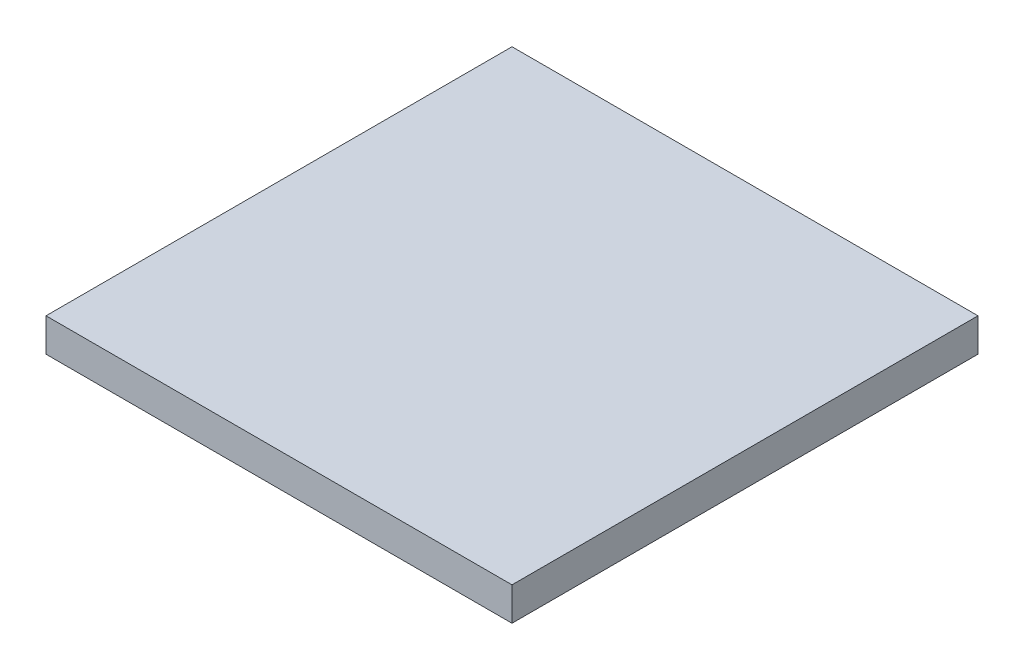
ISO-10303-21;
HEADER;
FILE_DESCRIPTION(('STEP AP214'),'2;1');
FILE_NAME('part.step','',(''),(''),'','','');
FILE_SCHEMA(('AUTOMOTIVE_DESIGN { 1 0 10303 214 1 1 1 1 }'));
ENDSEC;
DATA;
#1=APPLICATION_CONTEXT('core data for automotive mechanical design processes');
#2=APPLICATION_PROTOCOL_DEFINITION('international standard','automotive_design',2000,#1);
#3=PRODUCT_CONTEXT('',#1,'mechanical');
#4=PRODUCT('Part','Part','',(#3));
#5=PRODUCT_RELATED_PRODUCT_CATEGORY('part','',(#4));
#6=PRODUCT_DEFINITION_FORMATION('','',#4);
#7=PRODUCT_DEFINITION_CONTEXT('part definition',#1,'design');
#8=PRODUCT_DEFINITION('design','',#6,#7);
#9=PRODUCT_DEFINITION_SHAPE('','',#8);
#10=(LENGTH_UNIT() NAMED_UNIT(*) SI_UNIT(.MILLI.,.METRE.));
#11=(NAMED_UNIT(*) PLANE_ANGLE_UNIT() SI_UNIT($,.RADIAN.));
#12=(NAMED_UNIT(*) SI_UNIT($,.STERADIAN.) SOLID_ANGLE_UNIT());
#13=UNCERTAINTY_MEASURE_WITH_UNIT(LENGTH_MEASURE(1.E-05),#10,'distance_accuracy_value','');
#14=(GEOMETRIC_REPRESENTATION_CONTEXT(3) GLOBAL_UNCERTAINTY_ASSIGNED_CONTEXT((#13)) GLOBAL_UNIT_ASSIGNED_CONTEXT((#10,
#11,#12)) REPRESENTATION_CONTEXT('',''));
#15=CARTESIAN_POINT('',(0.,0.,0.));
#16=DIRECTION('',(0.,0.,1.));
#17=DIRECTION('',(1.,0.,0.));
#18=AXIS2_PLACEMENT_3D('',#15,#16,#17);
#19=CARTESIAN_POINT('',(2.1,0.3,-2.10000000000001));
#20=DIRECTION('',(-1.,0.,0.));
#21=DIRECTION('',(0.,0.,1.));
#22=AXIS2_PLACEMENT_3D('',#19,#20,#21);
#23=PLANE('',#22);
#24=DIRECTION('',(0.,0.,-1.));
#25=VECTOR('',#24,1.);
#26=CARTESIAN_POINT('',(2.1,0.,-2.10000000000001));
#27=LINE('',#26,#25);
#28=CARTESIAN_POINT('',(2.1,0.,2.1));
#29=VERTEX_POINT('',#28);
#30=CARTESIAN_POINT('',(2.1,0.,-2.10000000000001));
#31=VERTEX_POINT('',#30);
#32=EDGE_CURVE('E98',#29,#31,#27,.T.);
#33=ORIENTED_EDGE('',*,*,#32,.T.);
#34=DIRECTION('',(0.,-1.,0.));
#35=VECTOR('',#34,1.);
#36=CARTESIAN_POINT('',(2.1,0.3,-2.10000000000001));
#37=LINE('',#36,#35);
#38=CARTESIAN_POINT('',(2.1,0.3,-2.10000000000001));
#39=VERTEX_POINT('',#38);
#40=EDGE_CURVE('E11',#39,#31,#37,.T.);
#41=ORIENTED_EDGE('',*,*,#40,.F.);
#42=DIRECTION('',(0.,0.,-1.));
#43=VECTOR('',#42,1.);
#44=CARTESIAN_POINT('',(2.1,0.3,-2.10000000000001));
#45=LINE('',#44,#43);
#46=CARTESIAN_POINT('',(2.1,0.3,2.1));
#47=VERTEX_POINT('',#46);
#48=EDGE_CURVE('E86',#47,#39,#45,.T.);
#49=ORIENTED_EDGE('',*,*,#48,.F.);
#50=DIRECTION('',(0.,-1.,0.));
#51=VECTOR('',#50,1.);
#52=CARTESIAN_POINT('',(2.1,0.3,2.1));
#53=LINE('',#52,#51);
#54=EDGE_CURVE('E94',#47,#29,#53,.T.);
#55=ORIENTED_EDGE('',*,*,#54,.T.);
#56=EDGE_LOOP('',(#33,#41,#49,#55));
#57=FACE_BOUND('',#56,.T.);
#58=ADVANCED_FACE('F35',(#57),#23,.F.);
#59=CARTESIAN_POINT('',(-2.1,0.3,-2.10000000000001));
#60=DIRECTION('',(0.,0.,1.));
#61=DIRECTION('',(1.,0.,0.));
#62=AXIS2_PLACEMENT_3D('',#59,#60,#61);
#63=PLANE('',#62);
#64=DIRECTION('',(-1.,0.,0.));
#65=VECTOR('',#64,1.);
#66=CARTESIAN_POINT('',(-2.1,0.,-2.10000000000001));
#67=LINE('',#66,#65);
#68=CARTESIAN_POINT('',(-2.1,0.,-2.10000000000001));
#69=VERTEX_POINT('',#68);
#70=EDGE_CURVE('E90',#31,#69,#67,.T.);
#71=ORIENTED_EDGE('',*,*,#70,.T.);
#72=DIRECTION('',(0.,-1.,0.));
#73=VECTOR('',#72,1.);
#74=CARTESIAN_POINT('',(-2.1,0.3,-2.10000000000001));
#75=LINE('',#74,#73);
#76=CARTESIAN_POINT('',(-2.1,0.3,-2.10000000000001));
#77=VERTEX_POINT('',#76);
#78=EDGE_CURVE('E43',#77,#69,#75,.T.);
#79=ORIENTED_EDGE('',*,*,#78,.F.);
#80=DIRECTION('',(-1.,0.,0.));
#81=VECTOR('',#80,1.);
#82=CARTESIAN_POINT('',(-2.1,0.3,-2.10000000000001));
#83=LINE('',#82,#81);
#84=EDGE_CURVE('E81',#39,#77,#83,.T.);
#85=ORIENTED_EDGE('',*,*,#84,.F.);
#86=ORIENTED_EDGE('',*,*,#40,.T.);
#87=EDGE_LOOP('',(#71,#79,#85,#86));
#88=FACE_BOUND('',#87,.T.);
#89=ADVANCED_FACE('F89',(#88),#63,.F.);
#90=CARTESIAN_POINT('',(-2.1,0.3,-2.10000000000001));
#91=DIRECTION('',(1.,0.,0.));
#92=DIRECTION('',(0.,0.,-1.));
#93=AXIS2_PLACEMENT_3D('',#90,#91,#92);
#94=PLANE('',#93);
#95=DIRECTION('',(0.,0.,1.));
#96=VECTOR('',#95,1.);
#97=CARTESIAN_POINT('',(-2.1,0.,-2.10000000000001));
#98=LINE('',#97,#96);
#99=CARTESIAN_POINT('',(-2.1,0.,2.1));
#100=VERTEX_POINT('',#99);
#101=EDGE_CURVE('E68',#69,#100,#98,.T.);
#102=ORIENTED_EDGE('',*,*,#101,.T.);
#103=DIRECTION('',(0.,-1.,0.));
#104=VECTOR('',#103,1.);
#105=CARTESIAN_POINT('',(-2.1,0.3,2.1));
#106=LINE('',#105,#104);
#107=CARTESIAN_POINT('',(-2.1,0.3,2.1));
#108=VERTEX_POINT('',#107);
#109=EDGE_CURVE('E91',#108,#100,#106,.T.);
#110=ORIENTED_EDGE('',*,*,#109,.F.);
#111=DIRECTION('',(0.,0.,1.));
#112=VECTOR('',#111,1.);
#113=CARTESIAN_POINT('',(-2.1,0.3,-2.10000000000001));
#114=LINE('',#113,#112);
#115=EDGE_CURVE('E84',#77,#108,#114,.T.);
#116=ORIENTED_EDGE('',*,*,#115,.F.);
#117=ORIENTED_EDGE('',*,*,#78,.T.);
#118=EDGE_LOOP('',(#102,#110,#116,#117));
#119=FACE_BOUND('',#118,.T.);
#120=ADVANCED_FACE('F92',(#119),#94,.F.);
#121=CARTESIAN_POINT('',(-2.1,0.3,2.1));
#122=DIRECTION('',(0.,0.,-1.));
#123=DIRECTION('',(-1.,0.,0.));
#124=AXIS2_PLACEMENT_3D('',#121,#122,#123);
#125=PLANE('',#124);
#126=DIRECTION('',(1.,0.,0.));
#127=VECTOR('',#126,1.);
#128=CARTESIAN_POINT('',(-2.1,0.,2.1));
#129=LINE('',#128,#127);
#130=EDGE_CURVE('E74',#100,#29,#129,.T.);
#131=ORIENTED_EDGE('',*,*,#130,.T.);
#132=ORIENTED_EDGE('',*,*,#54,.F.);
#133=DIRECTION('',(1.,0.,0.));
#134=VECTOR('',#133,1.);
#135=CARTESIAN_POINT('',(-2.1,0.3,2.1));
#136=LINE('',#135,#134);
#137=EDGE_CURVE('E51',#108,#47,#136,.T.);
#138=ORIENTED_EDGE('',*,*,#137,.F.);
#139=ORIENTED_EDGE('',*,*,#109,.T.);
#140=EDGE_LOOP('',(#131,#132,#138,#139));
#141=FACE_BOUND('',#140,.T.);
#142=ADVANCED_FACE('F105',(#141),#125,.F.);
#143=CARTESIAN_POINT('',(0.,0.3,0.));
#144=DIRECTION('',(0.,1.,0.));
#145=DIRECTION('',(0.,0.,1.));
#146=AXIS2_PLACEMENT_3D('',#143,#144,#145);
#147=PLANE('',#146);
#148=ORIENTED_EDGE('',*,*,#48,.T.);
#149=ORIENTED_EDGE('',*,*,#84,.T.);
#150=ORIENTED_EDGE('',*,*,#115,.T.);
#151=ORIENTED_EDGE('',*,*,#137,.T.);
#152=EDGE_LOOP('',(#148,#149,#150,#151));
#153=FACE_BOUND('',#152,.T.);
#154=ADVANCED_FACE('F82',(#153),#147,.T.);
#155=CARTESIAN_POINT('',(0.,0.,0.));
#156=DIRECTION('',(0.,1.,0.));
#157=DIRECTION('',(0.,0.,1.));
#158=AXIS2_PLACEMENT_3D('',#155,#156,#157);
#159=PLANE('',#158);
#160=ORIENTED_EDGE('',*,*,#32,.F.);
#161=ORIENTED_EDGE('',*,*,#130,.F.);
#162=ORIENTED_EDGE('',*,*,#101,.F.);
#163=ORIENTED_EDGE('',*,*,#70,.F.);
#164=EDGE_LOOP('',(#160,#161,#162,#163));
#165=FACE_BOUND('',#164,.T.);
#166=ADVANCED_FACE('F108',(#165),#159,.F.);
#167=CLOSED_SHELL('',(#58,#89,#120,#142,#154,#166));
#168=MANIFOLD_SOLID_BREP('B2',#167);
#169=ADVANCED_BREP_SHAPE_REPRESENTATION('',(#18,#168),#14);
#170=SHAPE_DEFINITION_REPRESENTATION(#9,#169);
ENDSEC;
END-ISO-10303-21;
